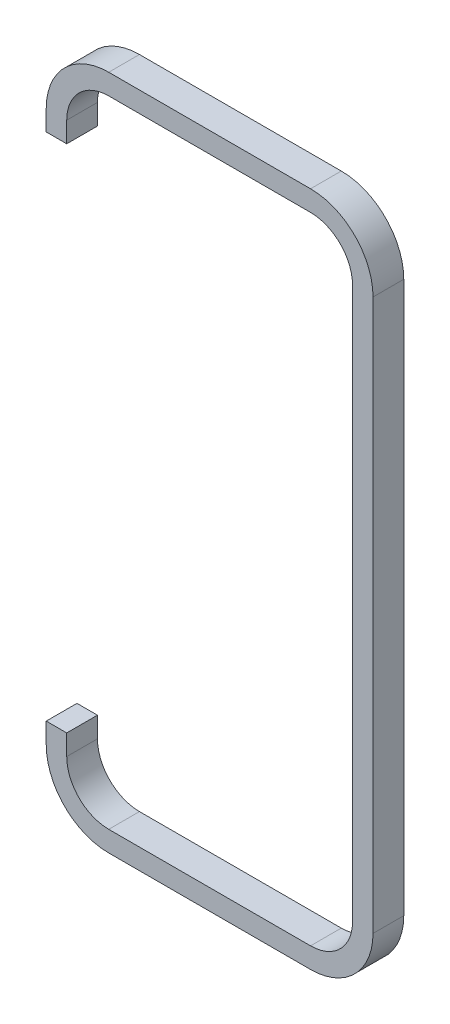
ISO-10303-21;
HEADER;
FILE_DESCRIPTION(('STEP AP214'),'2;1');
FILE_NAME('part.step','',(''),(''),'','','');
FILE_SCHEMA(('AUTOMOTIVE_DESIGN { 1 0 10303 214 1 1 1 1 }'));
ENDSEC;
DATA;
#1=APPLICATION_CONTEXT('core data for automotive mechanical design processes');
#2=APPLICATION_PROTOCOL_DEFINITION('international standard','automotive_design',2000,#1);
#3=PRODUCT_CONTEXT('',#1,'mechanical');
#4=PRODUCT('Part','Part','',(#3));
#5=PRODUCT_RELATED_PRODUCT_CATEGORY('part','',(#4));
#6=PRODUCT_DEFINITION_FORMATION('','',#4);
#7=PRODUCT_DEFINITION_CONTEXT('part definition',#1,'design');
#8=PRODUCT_DEFINITION('design','',#6,#7);
#9=PRODUCT_DEFINITION_SHAPE('','',#8);
#10=(LENGTH_UNIT() NAMED_UNIT(*) SI_UNIT(.MILLI.,.METRE.));
#11=(NAMED_UNIT(*) PLANE_ANGLE_UNIT() SI_UNIT($,.RADIAN.));
#12=(NAMED_UNIT(*) SI_UNIT($,.STERADIAN.) SOLID_ANGLE_UNIT());
#13=UNCERTAINTY_MEASURE_WITH_UNIT(LENGTH_MEASURE(1.E-05),#10,'distance_accuracy_value','');
#14=(GEOMETRIC_REPRESENTATION_CONTEXT(3) GLOBAL_UNCERTAINTY_ASSIGNED_CONTEXT((#13)) GLOBAL_UNIT_ASSIGNED_CONTEXT((#10,
#11,#12)) REPRESENTATION_CONTEXT('',''));
#15=CARTESIAN_POINT('',(0.,0.,0.));
#16=DIRECTION('',(0.,0.,1.));
#17=DIRECTION('',(1.,0.,0.));
#18=AXIS2_PLACEMENT_3D('',#15,#16,#17);
#19=CARTESIAN_POINT('',(-9.85,-26.9,3.));
#20=DIRECTION('',(0.,0.,-1.));
#21=DIRECTION('',(-1.,0.,0.));
#22=AXIS2_PLACEMENT_3D('',#19,#20,#21);
#23=CYLINDRICAL_SURFACE('',#22,4.09999999999999);
#24=CARTESIAN_POINT('',(-9.85,-26.9,0.));
#25=DIRECTION('',(0.,0.,-1.));
#26=DIRECTION('',(-1.,0.,0.));
#27=AXIS2_PLACEMENT_3D('',#24,#25,#26);
#28=CIRCLE('',#27,4.09999999999999);
#29=CARTESIAN_POINT('',(-9.84999999999994,-31.,0.));
#30=VERTEX_POINT('',#29);
#31=CARTESIAN_POINT('',(-13.95,-26.8999999999999,0.));
#32=VERTEX_POINT('',#31);
#33=EDGE_CURVE('E218',#30,#32,#28,.T.);
#34=ORIENTED_EDGE('',*,*,#33,.T.);
#35=DIRECTION('',(0.,0.,-1.));
#36=VECTOR('',#35,1.);
#37=CARTESIAN_POINT('',(-13.95,-26.8999999999999,3.));
#38=LINE('',#37,#36);
#39=CARTESIAN_POINT('',(-13.95,-26.8999999999999,3.));
#40=VERTEX_POINT('',#39);
#41=EDGE_CURVE('E11',#40,#32,#38,.T.);
#42=ORIENTED_EDGE('',*,*,#41,.F.);
#43=CARTESIAN_POINT('',(-9.85,-26.9,3.));
#44=DIRECTION('',(0.,0.,-1.));
#45=DIRECTION('',(-1.,0.,0.));
#46=AXIS2_PLACEMENT_3D('',#43,#44,#45);
#47=CIRCLE('',#46,4.09999999999999);
#48=CARTESIAN_POINT('',(-9.84999999999994,-31.,3.));
#49=VERTEX_POINT('',#48);
#50=EDGE_CURVE('E275',#49,#40,#47,.T.);
#51=ORIENTED_EDGE('',*,*,#50,.F.);
#52=DIRECTION('',(0.,0.,-1.));
#53=VECTOR('',#52,1.);
#54=CARTESIAN_POINT('',(-9.84999999999994,-31.,3.));
#55=LINE('',#54,#53);
#56=EDGE_CURVE('E214',#49,#30,#55,.T.);
#57=ORIENTED_EDGE('',*,*,#56,.T.);
#58=EDGE_LOOP('',(#34,#42,#51,#57));
#59=FACE_BOUND('',#58,.T.);
#60=ADVANCED_FACE('F43',(#59),#23,.F.);
#61=CARTESIAN_POINT('',(-13.95,-26.8999999999999,3.));
#62=DIRECTION('',(-1.,0.,0.));
#63=DIRECTION('',(0.,-1.,0.));
#64=AXIS2_PLACEMENT_3D('',#61,#62,#63);
#65=PLANE('',#64);
#66=DIRECTION('',(0.,1.,0.));
#67=VECTOR('',#66,1.);
#68=CARTESIAN_POINT('',(-13.95,-26.8999999999999,0.));
#69=LINE('',#68,#67);
#70=CARTESIAN_POINT('',(-13.95,-24.9,0.));
#71=VERTEX_POINT('',#70);
#72=EDGE_CURVE('E222',#32,#71,#69,.T.);
#73=ORIENTED_EDGE('',*,*,#72,.T.);
#74=DIRECTION('',(0.,0.,-1.));
#75=VECTOR('',#74,1.);
#76=CARTESIAN_POINT('',(-13.95,-24.9,3.));
#77=LINE('',#76,#75);
#78=CARTESIAN_POINT('',(-13.95,-24.9,3.));
#79=VERTEX_POINT('',#78);
#80=EDGE_CURVE('E52',#79,#71,#77,.T.);
#81=ORIENTED_EDGE('',*,*,#80,.F.);
#82=DIRECTION('',(0.,1.,0.));
#83=VECTOR('',#82,1.);
#84=CARTESIAN_POINT('',(-13.95,-26.8999999999999,3.));
#85=LINE('',#84,#83);
#86=EDGE_CURVE('E139',#40,#79,#85,.T.);
#87=ORIENTED_EDGE('',*,*,#86,.F.);
#88=ORIENTED_EDGE('',*,*,#41,.T.);
#89=EDGE_LOOP('',(#73,#81,#87,#88));
#90=FACE_BOUND('',#89,.T.);
#91=ADVANCED_FACE('F408',(#90),#65,.F.);
#92=CARTESIAN_POINT('',(-15.95,-24.9,3.));
#93=DIRECTION('',(0.,-1.,0.));
#94=DIRECTION('',(0.,0.,-1.));
#95=AXIS2_PLACEMENT_3D('',#92,#93,#94);
#96=PLANE('',#95);
#97=DIRECTION('',(-1.,0.,0.));
#98=VECTOR('',#97,1.);
#99=CARTESIAN_POINT('',(-15.95,-24.9,0.));
#100=LINE('',#99,#98);
#101=CARTESIAN_POINT('',(-15.95,-24.9,0.));
#102=VERTEX_POINT('',#101);
#103=EDGE_CURVE('E225',#71,#102,#100,.T.);
#104=ORIENTED_EDGE('',*,*,#103,.T.);
#105=DIRECTION('',(0.,0.,-1.));
#106=VECTOR('',#105,1.);
#107=CARTESIAN_POINT('',(-15.95,-24.9,3.));
#108=LINE('',#107,#106);
#109=CARTESIAN_POINT('',(-15.95,-24.9,3.));
#110=VERTEX_POINT('',#109);
#111=EDGE_CURVE('E334',#110,#102,#108,.T.);
#112=ORIENTED_EDGE('',*,*,#111,.F.);
#113=DIRECTION('',(-1.,0.,0.));
#114=VECTOR('',#113,1.);
#115=CARTESIAN_POINT('',(-15.95,-24.9,3.));
#116=LINE('',#115,#114);
#117=EDGE_CURVE('E344',#79,#110,#116,.T.);
#118=ORIENTED_EDGE('',*,*,#117,.F.);
#119=ORIENTED_EDGE('',*,*,#80,.T.);
#120=EDGE_LOOP('',(#104,#112,#118,#119));
#121=FACE_BOUND('',#120,.T.);
#122=ADVANCED_FACE('F342',(#121),#96,.F.);
#123=CARTESIAN_POINT('',(-15.95,-26.8999999999999,3.));
#124=DIRECTION('',(1.,0.,0.));
#125=DIRECTION('',(0.,0.,-1.));
#126=AXIS2_PLACEMENT_3D('',#123,#124,#125);
#127=PLANE('',#126);
#128=DIRECTION('',(0.,-1.,0.));
#129=VECTOR('',#128,1.);
#130=CARTESIAN_POINT('',(-15.95,-26.8999999999999,0.));
#131=LINE('',#130,#129);
#132=CARTESIAN_POINT('',(-15.95,-26.8999999999999,0.));
#133=VERTEX_POINT('',#132);
#134=EDGE_CURVE('E227',#102,#133,#131,.T.);
#135=ORIENTED_EDGE('',*,*,#134,.T.);
#136=DIRECTION('',(0.,0.,-1.));
#137=VECTOR('',#136,1.);
#138=CARTESIAN_POINT('',(-15.95,-26.8999999999999,3.));
#139=LINE('',#138,#137);
#140=CARTESIAN_POINT('',(-15.95,-26.8999999999999,3.));
#141=VERTEX_POINT('',#140);
#142=EDGE_CURVE('E330',#141,#133,#139,.T.);
#143=ORIENTED_EDGE('',*,*,#142,.F.);
#144=DIRECTION('',(0.,-1.,0.));
#145=VECTOR('',#144,1.);
#146=CARTESIAN_POINT('',(-15.95,-26.8999999999999,3.));
#147=LINE('',#146,#145);
#148=EDGE_CURVE('E363',#110,#141,#147,.T.);
#149=ORIENTED_EDGE('',*,*,#148,.F.);
#150=ORIENTED_EDGE('',*,*,#111,.T.);
#151=EDGE_LOOP('',(#135,#143,#149,#150));
#152=FACE_BOUND('',#151,.T.);
#153=ADVANCED_FACE('F353',(#152),#127,.F.);
#154=CARTESIAN_POINT('',(-9.85,-26.9,3.));
#155=DIRECTION('',(0.,0.,-1.));
#156=DIRECTION('',(-1.,0.,0.));
#157=AXIS2_PLACEMENT_3D('',#154,#155,#156);
#158=CYLINDRICAL_SURFACE('',#157,6.1);
#159=CARTESIAN_POINT('',(-9.85,-26.9,0.));
#160=DIRECTION('',(0.,0.,1.));
#161=DIRECTION('',(-1.,0.,0.));
#162=AXIS2_PLACEMENT_3D('',#159,#160,#161);
#163=CIRCLE('',#162,6.1);
#164=CARTESIAN_POINT('',(-9.84999999999994,-33.,0.));
#165=VERTEX_POINT('',#164);
#166=EDGE_CURVE('E230',#133,#165,#163,.T.);
#167=ORIENTED_EDGE('',*,*,#166,.T.);
#168=DIRECTION('',(0.,0.,-1.));
#169=VECTOR('',#168,1.);
#170=CARTESIAN_POINT('',(-9.84999999999994,-33.,3.));
#171=LINE('',#170,#169);
#172=CARTESIAN_POINT('',(-9.84999999999994,-33.,3.));
#173=VERTEX_POINT('',#172);
#174=EDGE_CURVE('E326',#173,#165,#171,.T.);
#175=ORIENTED_EDGE('',*,*,#174,.F.);
#176=CARTESIAN_POINT('',(-9.85,-26.9,3.));
#177=DIRECTION('',(0.,0.,1.));
#178=DIRECTION('',(-1.,0.,0.));
#179=AXIS2_PLACEMENT_3D('',#176,#177,#178);
#180=CIRCLE('',#179,6.1);
#181=EDGE_CURVE('E359',#141,#173,#180,.T.);
#182=ORIENTED_EDGE('',*,*,#181,.F.);
#183=ORIENTED_EDGE('',*,*,#142,.T.);
#184=EDGE_LOOP('',(#167,#175,#182,#183));
#185=FACE_BOUND('',#184,.T.);
#186=ADVANCED_FACE('F357',(#185),#158,.T.);
#187=CARTESIAN_POINT('',(9.84999999999991,-33.,3.));
#188=DIRECTION('',(0.,1.,0.));
#189=DIRECTION('',(0.,0.,1.));
#190=AXIS2_PLACEMENT_3D('',#187,#188,#189);
#191=PLANE('',#190);
#192=DIRECTION('',(1.,0.,0.));
#193=VECTOR('',#192,1.);
#194=CARTESIAN_POINT('',(9.84999999999991,-33.,0.));
#195=LINE('',#194,#193);
#196=CARTESIAN_POINT('',(9.84999999999991,-33.,0.));
#197=VERTEX_POINT('',#196);
#198=EDGE_CURVE('E233',#165,#197,#195,.T.);
#199=ORIENTED_EDGE('',*,*,#198,.T.);
#200=DIRECTION('',(0.,0.,-1.));
#201=VECTOR('',#200,1.);
#202=CARTESIAN_POINT('',(9.84999999999991,-33.,3.));
#203=LINE('',#202,#201);
#204=CARTESIAN_POINT('',(9.84999999999991,-33.,3.));
#205=VERTEX_POINT('',#204);
#206=EDGE_CURVE('E322',#205,#197,#203,.T.);
#207=ORIENTED_EDGE('',*,*,#206,.F.);
#208=DIRECTION('',(1.,0.,0.));
#209=VECTOR('',#208,1.);
#210=CARTESIAN_POINT('',(9.84999999999991,-33.,3.));
#211=LINE('',#210,#209);
#212=EDGE_CURVE('E362',#173,#205,#211,.T.);
#213=ORIENTED_EDGE('',*,*,#212,.F.);
#214=ORIENTED_EDGE('',*,*,#174,.T.);
#215=EDGE_LOOP('',(#199,#207,#213,#214));
#216=FACE_BOUND('',#215,.T.);
#217=ADVANCED_FACE('F419',(#216),#191,.F.);
#218=CARTESIAN_POINT('',(9.85,-26.9,3.));
#219=DIRECTION('',(0.,0.,-1.));
#220=DIRECTION('',(-1.,0.,0.));
#221=AXIS2_PLACEMENT_3D('',#218,#219,#220);
#222=CYLINDRICAL_SURFACE('',#221,6.1);
#223=CARTESIAN_POINT('',(9.85,-26.9,0.));
#224=DIRECTION('',(0.,0.,1.));
#225=DIRECTION('',(-1.,0.,0.));
#226=AXIS2_PLACEMENT_3D('',#223,#224,#225);
#227=CIRCLE('',#226,6.1);
#228=CARTESIAN_POINT('',(15.95,-26.8999999999999,0.));
#229=VERTEX_POINT('',#228);
#230=EDGE_CURVE('E236',#197,#229,#227,.T.);
#231=ORIENTED_EDGE('',*,*,#230,.T.);
#232=DIRECTION('',(0.,0.,-1.));
#233=VECTOR('',#232,1.);
#234=CARTESIAN_POINT('',(15.95,-26.8999999999999,3.));
#235=LINE('',#234,#233);
#236=CARTESIAN_POINT('',(15.95,-26.8999999999999,3.));
#237=VERTEX_POINT('',#236);
#238=EDGE_CURVE('E318',#237,#229,#235,.T.);
#239=ORIENTED_EDGE('',*,*,#238,.F.);
#240=CARTESIAN_POINT('',(9.85,-26.9,3.));
#241=DIRECTION('',(0.,0.,1.));
#242=DIRECTION('',(-1.,0.,0.));
#243=AXIS2_PLACEMENT_3D('',#240,#241,#242);
#244=CIRCLE('',#243,6.1);
#245=EDGE_CURVE('E367',#205,#237,#244,.T.);
#246=ORIENTED_EDGE('',*,*,#245,.F.);
#247=ORIENTED_EDGE('',*,*,#206,.T.);
#248=EDGE_LOOP('',(#231,#239,#246,#247));
#249=FACE_BOUND('',#248,.T.);
#250=ADVANCED_FACE('F422',(#249),#222,.T.);
#251=CARTESIAN_POINT('',(15.95,-26.8999999999999,3.));
#252=DIRECTION('',(-1.,0.,0.));
#253=DIRECTION('',(0.,0.,1.));
#254=AXIS2_PLACEMENT_3D('',#251,#252,#253);
#255=PLANE('',#254);
#256=DIRECTION('',(0.,1.,0.));
#257=VECTOR('',#256,1.);
#258=CARTESIAN_POINT('',(15.95,-26.8999999999999,0.));
#259=LINE('',#258,#257);
#260=CARTESIAN_POINT('',(15.95,26.8999999999999,0.));
#261=VERTEX_POINT('',#260);
#262=EDGE_CURVE('E239',#229,#261,#259,.T.);
#263=ORIENTED_EDGE('',*,*,#262,.T.);
#264=DIRECTION('',(0.,0.,-1.));
#265=VECTOR('',#264,1.);
#266=CARTESIAN_POINT('',(15.95,26.8999999999999,3.));
#267=LINE('',#266,#265);
#268=CARTESIAN_POINT('',(15.95,26.8999999999999,3.));
#269=VERTEX_POINT('',#268);
#270=EDGE_CURVE('E314',#269,#261,#267,.T.);
#271=ORIENTED_EDGE('',*,*,#270,.F.);
#272=DIRECTION('',(0.,1.,0.));
#273=VECTOR('',#272,1.);
#274=CARTESIAN_POINT('',(15.95,-26.8999999999999,3.));
#275=LINE('',#274,#273);
#276=EDGE_CURVE('E375',#237,#269,#275,.T.);
#277=ORIENTED_EDGE('',*,*,#276,.F.);
#278=ORIENTED_EDGE('',*,*,#238,.T.);
#279=EDGE_LOOP('',(#263,#271,#277,#278));
#280=FACE_BOUND('',#279,.T.);
#281=ADVANCED_FACE('F426',(#280),#255,.F.);
#282=CARTESIAN_POINT('',(9.85,26.9,3.));
#283=DIRECTION('',(0.,0.,-1.));
#284=DIRECTION('',(-1.,0.,0.));
#285=AXIS2_PLACEMENT_3D('',#282,#283,#284);
#286=CYLINDRICAL_SURFACE('',#285,6.1);
#287=CARTESIAN_POINT('',(9.85,26.9,0.));
#288=DIRECTION('',(0.,0.,1.));
#289=DIRECTION('',(1.,0.,0.));
#290=AXIS2_PLACEMENT_3D('',#287,#288,#289);
#291=CIRCLE('',#290,6.1);
#292=CARTESIAN_POINT('',(9.84999999999994,33.,0.));
#293=VERTEX_POINT('',#292);
#294=EDGE_CURVE('E242',#261,#293,#291,.T.);
#295=ORIENTED_EDGE('',*,*,#294,.T.);
#296=DIRECTION('',(0.,0.,-1.));
#297=VECTOR('',#296,1.);
#298=CARTESIAN_POINT('',(9.84999999999994,33.,3.));
#299=LINE('',#298,#297);
#300=CARTESIAN_POINT('',(9.84999999999994,33.,3.));
#301=VERTEX_POINT('',#300);
#302=EDGE_CURVE('E310',#301,#293,#299,.T.);
#303=ORIENTED_EDGE('',*,*,#302,.F.);
#304=CARTESIAN_POINT('',(9.85,26.9,3.));
#305=DIRECTION('',(0.,0.,1.));
#306=DIRECTION('',(1.,0.,0.));
#307=AXIS2_PLACEMENT_3D('',#304,#305,#306);
#308=CIRCLE('',#307,6.1);
#309=EDGE_CURVE('E378',#269,#301,#308,.T.);
#310=ORIENTED_EDGE('',*,*,#309,.F.);
#311=ORIENTED_EDGE('',*,*,#270,.T.);
#312=EDGE_LOOP('',(#295,#303,#310,#311));
#313=FACE_BOUND('',#312,.T.);
#314=ADVANCED_FACE('F430',(#313),#286,.T.);
#315=CARTESIAN_POINT('',(9.84999999999994,33.,3.));
#316=DIRECTION('',(0.,-1.,0.));
#317=DIRECTION('',(0.,0.,-1.));
#318=AXIS2_PLACEMENT_3D('',#315,#316,#317);
#319=PLANE('',#318);
#320=DIRECTION('',(-1.,0.,0.));
#321=VECTOR('',#320,1.);
#322=CARTESIAN_POINT('',(9.84999999999994,33.,0.));
#323=LINE('',#322,#321);
#324=CARTESIAN_POINT('',(-9.84999999999992,33.,0.));
#325=VERTEX_POINT('',#324);
#326=EDGE_CURVE('E245',#293,#325,#323,.T.);
#327=ORIENTED_EDGE('',*,*,#326,.T.);
#328=DIRECTION('',(0.,0.,-1.));
#329=VECTOR('',#328,1.);
#330=CARTESIAN_POINT('',(-9.84999999999992,33.,3.));
#331=LINE('',#330,#329);
#332=CARTESIAN_POINT('',(-9.84999999999992,33.,3.));
#333=VERTEX_POINT('',#332);
#334=EDGE_CURVE('E306',#333,#325,#331,.T.);
#335=ORIENTED_EDGE('',*,*,#334,.F.);
#336=DIRECTION('',(-1.,0.,0.));
#337=VECTOR('',#336,1.);
#338=CARTESIAN_POINT('',(9.84999999999994,33.,3.));
#339=LINE('',#338,#337);
#340=EDGE_CURVE('E381',#301,#333,#339,.T.);
#341=ORIENTED_EDGE('',*,*,#340,.F.);
#342=ORIENTED_EDGE('',*,*,#302,.T.);
#343=EDGE_LOOP('',(#327,#335,#341,#342));
#344=FACE_BOUND('',#343,.T.);
#345=ADVANCED_FACE('F434',(#344),#319,.F.);
#346=CARTESIAN_POINT('',(-9.85,26.9,3.));
#347=DIRECTION('',(0.,0.,-1.));
#348=DIRECTION('',(-1.,0.,0.));
#349=AXIS2_PLACEMENT_3D('',#346,#347,#348);
#350=CYLINDRICAL_SURFACE('',#349,6.1);
#351=CARTESIAN_POINT('',(-9.85,26.9,0.));
#352=DIRECTION('',(0.,0.,1.));
#353=DIRECTION('',(-1.,0.,0.));
#354=AXIS2_PLACEMENT_3D('',#351,#352,#353);
#355=CIRCLE('',#354,6.1);
#356=CARTESIAN_POINT('',(-15.95,26.9,0.));
#357=VERTEX_POINT('',#356);
#358=EDGE_CURVE('E248',#325,#357,#355,.T.);
#359=ORIENTED_EDGE('',*,*,#358,.T.);
#360=DIRECTION('',(0.,0.,-1.));
#361=VECTOR('',#360,1.);
#362=CARTESIAN_POINT('',(-15.95,26.9,3.));
#363=LINE('',#362,#361);
#364=CARTESIAN_POINT('',(-15.95,26.9,3.));
#365=VERTEX_POINT('',#364);
#366=EDGE_CURVE('E302',#365,#357,#363,.T.);
#367=ORIENTED_EDGE('',*,*,#366,.F.);
#368=CARTESIAN_POINT('',(-9.85,26.9,3.));
#369=DIRECTION('',(0.,0.,1.));
#370=DIRECTION('',(-1.,0.,0.));
#371=AXIS2_PLACEMENT_3D('',#368,#369,#370);
#372=CIRCLE('',#371,6.1);
#373=EDGE_CURVE('E383',#333,#365,#372,.T.);
#374=ORIENTED_EDGE('',*,*,#373,.F.);
#375=ORIENTED_EDGE('',*,*,#334,.T.);
#376=EDGE_LOOP('',(#359,#367,#374,#375));
#377=FACE_BOUND('',#376,.T.);
#378=ADVANCED_FACE('F438',(#377),#350,.T.);
#379=CARTESIAN_POINT('',(-15.95,24.9,3.));
#380=DIRECTION('',(1.,0.,0.));
#381=DIRECTION('',(0.,0.,-1.));
#382=AXIS2_PLACEMENT_3D('',#379,#380,#381);
#383=PLANE('',#382);
#384=DIRECTION('',(0.,-1.,0.));
#385=VECTOR('',#384,1.);
#386=CARTESIAN_POINT('',(-15.95,24.9,0.));
#387=LINE('',#386,#385);
#388=CARTESIAN_POINT('',(-15.95,24.9,0.));
#389=VERTEX_POINT('',#388);
#390=EDGE_CURVE('E251',#357,#389,#387,.T.);
#391=ORIENTED_EDGE('',*,*,#390,.T.);
#392=DIRECTION('',(0.,0.,-1.));
#393=VECTOR('',#392,1.);
#394=CARTESIAN_POINT('',(-15.95,24.9,3.));
#395=LINE('',#394,#393);
#396=CARTESIAN_POINT('',(-15.95,24.9,3.));
#397=VERTEX_POINT('',#396);
#398=EDGE_CURVE('E298',#397,#389,#395,.T.);
#399=ORIENTED_EDGE('',*,*,#398,.F.);
#400=DIRECTION('',(0.,-1.,0.));
#401=VECTOR('',#400,1.);
#402=CARTESIAN_POINT('',(-15.95,24.9,3.));
#403=LINE('',#402,#401);
#404=EDGE_CURVE('E386',#365,#397,#403,.T.);
#405=ORIENTED_EDGE('',*,*,#404,.F.);
#406=ORIENTED_EDGE('',*,*,#366,.T.);
#407=EDGE_LOOP('',(#391,#399,#405,#406));
#408=FACE_BOUND('',#407,.T.);
#409=ADVANCED_FACE('F442',(#408),#383,.F.);
#410=CARTESIAN_POINT('',(-15.95,24.9,3.));
#411=DIRECTION('',(0.,1.,0.));
#412=DIRECTION('',(0.,0.,1.));
#413=AXIS2_PLACEMENT_3D('',#410,#411,#412);
#414=PLANE('',#413);
#415=DIRECTION('',(1.,0.,0.));
#416=VECTOR('',#415,1.);
#417=CARTESIAN_POINT('',(-15.95,24.9,0.));
#418=LINE('',#417,#416);
#419=CARTESIAN_POINT('',(-13.95,24.9,0.));
#420=VERTEX_POINT('',#419);
#421=EDGE_CURVE('E254',#389,#420,#418,.T.);
#422=ORIENTED_EDGE('',*,*,#421,.T.);
#423=DIRECTION('',(0.,0.,-1.));
#424=VECTOR('',#423,1.);
#425=CARTESIAN_POINT('',(-13.95,24.9,3.));
#426=LINE('',#425,#424);
#427=CARTESIAN_POINT('',(-13.95,24.9,3.));
#428=VERTEX_POINT('',#427);
#429=EDGE_CURVE('E294',#428,#420,#426,.T.);
#430=ORIENTED_EDGE('',*,*,#429,.F.);
#431=DIRECTION('',(1.,0.,0.));
#432=VECTOR('',#431,1.);
#433=CARTESIAN_POINT('',(-15.95,24.9,3.));
#434=LINE('',#433,#432);
#435=EDGE_CURVE('E389',#397,#428,#434,.T.);
#436=ORIENTED_EDGE('',*,*,#435,.F.);
#437=ORIENTED_EDGE('',*,*,#398,.T.);
#438=EDGE_LOOP('',(#422,#430,#436,#437));
#439=FACE_BOUND('',#438,.T.);
#440=ADVANCED_FACE('F446',(#439),#414,.F.);
#441=CARTESIAN_POINT('',(-13.95,24.9,3.));
#442=DIRECTION('',(-1.,0.,0.));
#443=DIRECTION('',(0.,-1.,0.));
#444=AXIS2_PLACEMENT_3D('',#441,#442,#443);
#445=PLANE('',#444);
#446=DIRECTION('',(0.,1.,0.));
#447=VECTOR('',#446,1.);
#448=CARTESIAN_POINT('',(-13.95,24.9,0.));
#449=LINE('',#448,#447);
#450=CARTESIAN_POINT('',(-13.95,26.9,0.));
#451=VERTEX_POINT('',#450);
#452=EDGE_CURVE('E257',#420,#451,#449,.T.);
#453=ORIENTED_EDGE('',*,*,#452,.T.);
#454=DIRECTION('',(0.,0.,-1.));
#455=VECTOR('',#454,1.);
#456=CARTESIAN_POINT('',(-13.95,26.9,3.));
#457=LINE('',#456,#455);
#458=CARTESIAN_POINT('',(-13.95,26.9,3.));
#459=VERTEX_POINT('',#458);
#460=EDGE_CURVE('E290',#459,#451,#457,.T.);
#461=ORIENTED_EDGE('',*,*,#460,.F.);
#462=DIRECTION('',(0.,1.,0.));
#463=VECTOR('',#462,1.);
#464=CARTESIAN_POINT('',(-13.95,24.9,3.));
#465=LINE('',#464,#463);
#466=EDGE_CURVE('E392',#428,#459,#465,.T.);
#467=ORIENTED_EDGE('',*,*,#466,.F.);
#468=ORIENTED_EDGE('',*,*,#429,.T.);
#469=EDGE_LOOP('',(#453,#461,#467,#468));
#470=FACE_BOUND('',#469,.T.);
#471=ADVANCED_FACE('F450',(#470),#445,.F.);
#472=CARTESIAN_POINT('',(-9.85,26.9,3.));
#473=DIRECTION('',(0.,0.,-1.));
#474=DIRECTION('',(-1.,0.,0.));
#475=AXIS2_PLACEMENT_3D('',#472,#473,#474);
#476=CYLINDRICAL_SURFACE('',#475,4.09999999999999);
#477=CARTESIAN_POINT('',(-9.85,26.9,0.));
#478=DIRECTION('',(0.,0.,-1.));
#479=DIRECTION('',(-1.,0.,0.));
#480=AXIS2_PLACEMENT_3D('',#477,#478,#479);
#481=CIRCLE('',#480,4.09999999999999);
#482=CARTESIAN_POINT('',(-9.84999999999995,31.,0.));
#483=VERTEX_POINT('',#482);
#484=EDGE_CURVE('E260',#451,#483,#481,.T.);
#485=ORIENTED_EDGE('',*,*,#484,.T.);
#486=DIRECTION('',(0.,0.,-1.));
#487=VECTOR('',#486,1.);
#488=CARTESIAN_POINT('',(-9.84999999999995,31.,3.));
#489=LINE('',#488,#487);
#490=CARTESIAN_POINT('',(-9.84999999999995,31.,3.));
#491=VERTEX_POINT('',#490);
#492=EDGE_CURVE('E286',#491,#483,#489,.T.);
#493=ORIENTED_EDGE('',*,*,#492,.F.);
#494=CARTESIAN_POINT('',(-9.85,26.9,3.));
#495=DIRECTION('',(0.,0.,-1.));
#496=DIRECTION('',(-1.,0.,0.));
#497=AXIS2_PLACEMENT_3D('',#494,#495,#496);
#498=CIRCLE('',#497,4.09999999999999);
#499=EDGE_CURVE('E395',#459,#491,#498,.T.);
#500=ORIENTED_EDGE('',*,*,#499,.F.);
#501=ORIENTED_EDGE('',*,*,#460,.T.);
#502=EDGE_LOOP('',(#485,#493,#500,#501));
#503=FACE_BOUND('',#502,.T.);
#504=ADVANCED_FACE('F454',(#503),#476,.F.);
#505=CARTESIAN_POINT('',(9.84999999999994,31.,3.));
#506=DIRECTION('',(0.,1.,0.));
#507=DIRECTION('',(-1.,0.,0.));
#508=AXIS2_PLACEMENT_3D('',#505,#506,#507);
#509=PLANE('',#508);
#510=DIRECTION('',(1.,0.,0.));
#511=VECTOR('',#510,1.);
#512=CARTESIAN_POINT('',(9.84999999999994,31.,0.));
#513=LINE('',#512,#511);
#514=CARTESIAN_POINT('',(9.84999999999994,31.,0.));
#515=VERTEX_POINT('',#514);
#516=EDGE_CURVE('E263',#483,#515,#513,.T.);
#517=ORIENTED_EDGE('',*,*,#516,.T.);
#518=DIRECTION('',(0.,0.,-1.));
#519=VECTOR('',#518,1.);
#520=CARTESIAN_POINT('',(9.84999999999994,31.,3.));
#521=LINE('',#520,#519);
#522=CARTESIAN_POINT('',(9.84999999999994,31.,3.));
#523=VERTEX_POINT('',#522);
#524=EDGE_CURVE('E282',#523,#515,#521,.T.);
#525=ORIENTED_EDGE('',*,*,#524,.F.);
#526=DIRECTION('',(1.,0.,0.));
#527=VECTOR('',#526,1.);
#528=CARTESIAN_POINT('',(9.84999999999994,31.,3.));
#529=LINE('',#528,#527);
#530=EDGE_CURVE('E398',#491,#523,#529,.T.);
#531=ORIENTED_EDGE('',*,*,#530,.F.);
#532=ORIENTED_EDGE('',*,*,#492,.T.);
#533=EDGE_LOOP('',(#517,#525,#531,#532));
#534=FACE_BOUND('',#533,.T.);
#535=ADVANCED_FACE('F458',(#534),#509,.F.);
#536=CARTESIAN_POINT('',(9.85,26.9,3.));
#537=DIRECTION('',(0.,0.,-1.));
#538=DIRECTION('',(-1.,0.,0.));
#539=AXIS2_PLACEMENT_3D('',#536,#537,#538);
#540=CYLINDRICAL_SURFACE('',#539,4.10000000000001);
#541=CARTESIAN_POINT('',(9.85,26.9,0.));
#542=DIRECTION('',(0.,0.,-1.));
#543=DIRECTION('',(1.,0.,0.));
#544=AXIS2_PLACEMENT_3D('',#541,#542,#543);
#545=CIRCLE('',#544,4.10000000000001);
#546=CARTESIAN_POINT('',(13.95,26.8999999999999,0.));
#547=VERTEX_POINT('',#546);
#548=EDGE_CURVE('E266',#515,#547,#545,.T.);
#549=ORIENTED_EDGE('',*,*,#548,.T.);
#550=DIRECTION('',(0.,0.,-1.));
#551=VECTOR('',#550,1.);
#552=CARTESIAN_POINT('',(13.95,26.8999999999999,3.));
#553=LINE('',#552,#551);
#554=CARTESIAN_POINT('',(13.95,26.8999999999999,3.));
#555=VERTEX_POINT('',#554);
#556=EDGE_CURVE('E205',#555,#547,#553,.T.);
#557=ORIENTED_EDGE('',*,*,#556,.F.);
#558=CARTESIAN_POINT('',(9.85,26.9,3.));
#559=DIRECTION('',(0.,0.,-1.));
#560=DIRECTION('',(1.,0.,0.));
#561=AXIS2_PLACEMENT_3D('',#558,#559,#560);
#562=CIRCLE('',#561,4.10000000000001);
#563=EDGE_CURVE('E194',#523,#555,#562,.T.);
#564=ORIENTED_EDGE('',*,*,#563,.F.);
#565=ORIENTED_EDGE('',*,*,#524,.T.);
#566=EDGE_LOOP('',(#549,#557,#564,#565));
#567=FACE_BOUND('',#566,.T.);
#568=ADVANCED_FACE('F462',(#567),#540,.F.);
#569=CARTESIAN_POINT('',(13.95,-26.8999999999999,3.));
#570=DIRECTION('',(1.,0.,0.));
#571=DIRECTION('',(0.,1.,0.));
#572=AXIS2_PLACEMENT_3D('',#569,#570,#571);
#573=PLANE('',#572);
#574=DIRECTION('',(0.,-1.,0.));
#575=VECTOR('',#574,1.);
#576=CARTESIAN_POINT('',(13.95,-26.8999999999999,0.));
#577=LINE('',#576,#575);
#578=CARTESIAN_POINT('',(13.95,-26.8999999999999,0.));
#579=VERTEX_POINT('',#578);
#580=EDGE_CURVE('E203',#547,#579,#577,.T.);
#581=ORIENTED_EDGE('',*,*,#580,.T.);
#582=DIRECTION('',(0.,0.,-1.));
#583=VECTOR('',#582,1.);
#584=CARTESIAN_POINT('',(13.95,-26.8999999999999,3.));
#585=LINE('',#584,#583);
#586=CARTESIAN_POINT('',(13.95,-26.8999999999999,3.));
#587=VERTEX_POINT('',#586);
#588=EDGE_CURVE('E200',#587,#579,#585,.T.);
#589=ORIENTED_EDGE('',*,*,#588,.F.);
#590=DIRECTION('',(0.,-1.,0.));
#591=VECTOR('',#590,1.);
#592=CARTESIAN_POINT('',(13.95,-26.8999999999999,3.));
#593=LINE('',#592,#591);
#594=EDGE_CURVE('E188',#555,#587,#593,.T.);
#595=ORIENTED_EDGE('',*,*,#594,.F.);
#596=ORIENTED_EDGE('',*,*,#556,.T.);
#597=EDGE_LOOP('',(#581,#589,#595,#596));
#598=FACE_BOUND('',#597,.T.);
#599=ADVANCED_FACE('F201',(#598),#573,.F.);
#600=CARTESIAN_POINT('',(9.85,-26.9,3.));
#601=DIRECTION('',(0.,0.,-1.));
#602=DIRECTION('',(-1.,0.,0.));
#603=AXIS2_PLACEMENT_3D('',#600,#601,#602);
#604=CYLINDRICAL_SURFACE('',#603,4.10000000000001);
#605=CARTESIAN_POINT('',(9.85,-26.9,0.));
#606=DIRECTION('',(0.,0.,-1.));
#607=DIRECTION('',(-1.,0.,0.));
#608=AXIS2_PLACEMENT_3D('',#605,#606,#607);
#609=CIRCLE('',#608,4.10000000000001);
#610=CARTESIAN_POINT('',(9.84999999999994,-31.,0.));
#611=VERTEX_POINT('',#610);
#612=EDGE_CURVE('E125',#579,#611,#609,.T.);
#613=ORIENTED_EDGE('',*,*,#612,.T.);
#614=DIRECTION('',(0.,0.,-1.));
#615=VECTOR('',#614,1.);
#616=CARTESIAN_POINT('',(9.84999999999994,-31.,3.));
#617=LINE('',#616,#615);
#618=CARTESIAN_POINT('',(9.84999999999994,-31.,3.));
#619=VERTEX_POINT('',#618);
#620=EDGE_CURVE('E206',#619,#611,#617,.T.);
#621=ORIENTED_EDGE('',*,*,#620,.F.);
#622=CARTESIAN_POINT('',(9.85,-26.9,3.));
#623=DIRECTION('',(0.,0.,-1.));
#624=DIRECTION('',(-1.,0.,0.));
#625=AXIS2_PLACEMENT_3D('',#622,#623,#624);
#626=CIRCLE('',#625,4.10000000000001);
#627=EDGE_CURVE('E192',#587,#619,#626,.T.);
#628=ORIENTED_EDGE('',*,*,#627,.F.);
#629=ORIENTED_EDGE('',*,*,#588,.T.);
#630=EDGE_LOOP('',(#613,#621,#628,#629));
#631=FACE_BOUND('',#630,.T.);
#632=ADVANCED_FACE('F208',(#631),#604,.F.);
#633=CARTESIAN_POINT('',(9.84999999999994,-31.,3.));
#634=DIRECTION('',(0.,-1.,0.));
#635=DIRECTION('',(1.,0.,0.));
#636=AXIS2_PLACEMENT_3D('',#633,#634,#635);
#637=PLANE('',#636);
#638=DIRECTION('',(-1.,0.,0.));
#639=VECTOR('',#638,1.);
#640=CARTESIAN_POINT('',(9.84999999999994,-31.,0.));
#641=LINE('',#640,#639);
#642=EDGE_CURVE('E131',#611,#30,#641,.T.);
#643=ORIENTED_EDGE('',*,*,#642,.T.);
#644=ORIENTED_EDGE('',*,*,#56,.F.);
#645=DIRECTION('',(-1.,0.,0.));
#646=VECTOR('',#645,1.);
#647=CARTESIAN_POINT('',(9.84999999999994,-31.,3.));
#648=LINE('',#647,#646);
#649=EDGE_CURVE('E60',#619,#49,#648,.T.);
#650=ORIENTED_EDGE('',*,*,#649,.F.);
#651=ORIENTED_EDGE('',*,*,#620,.T.);
#652=EDGE_LOOP('',(#643,#644,#650,#651));
#653=FACE_BOUND('',#652,.T.);
#654=ADVANCED_FACE('F471',(#653),#637,.F.);
#655=CARTESIAN_POINT('',(-9.85,-26.9,3.));
#656=DIRECTION('',(0.,0.,-1.));
#657=DIRECTION('',(-1.,0.,0.));
#658=AXIS2_PLACEMENT_3D('',#655,#656,#657);
#659=PLANE('',#658);
#660=ORIENTED_EDGE('',*,*,#50,.T.);
#661=ORIENTED_EDGE('',*,*,#86,.T.);
#662=ORIENTED_EDGE('',*,*,#117,.T.);
#663=ORIENTED_EDGE('',*,*,#148,.T.);
#664=ORIENTED_EDGE('',*,*,#181,.T.);
#665=ORIENTED_EDGE('',*,*,#212,.T.);
#666=ORIENTED_EDGE('',*,*,#245,.T.);
#667=ORIENTED_EDGE('',*,*,#276,.T.);
#668=ORIENTED_EDGE('',*,*,#309,.T.);
#669=ORIENTED_EDGE('',*,*,#340,.T.);
#670=ORIENTED_EDGE('',*,*,#373,.T.);
#671=ORIENTED_EDGE('',*,*,#404,.T.);
#672=ORIENTED_EDGE('',*,*,#435,.T.);
#673=ORIENTED_EDGE('',*,*,#466,.T.);
#674=ORIENTED_EDGE('',*,*,#499,.T.);
#675=ORIENTED_EDGE('',*,*,#530,.T.);
#676=ORIENTED_EDGE('',*,*,#563,.T.);
#677=ORIENTED_EDGE('',*,*,#594,.T.);
#678=ORIENTED_EDGE('',*,*,#627,.T.);
#679=ORIENTED_EDGE('',*,*,#649,.T.);
#680=EDGE_LOOP('',(#660,#661,#662,#663,#664,#665,#666,#667,#668,#669,#670,#671,#672,#673,#674,
#675,#676,#677,#678,#679));
#681=FACE_BOUND('',#680,.T.);
#682=ADVANCED_FACE('F190',(#681),#659,.F.);
#683=CARTESIAN_POINT('',(-9.85,-26.9,0.));
#684=DIRECTION('',(0.,0.,-1.));
#685=DIRECTION('',(-1.,0.,0.));
#686=AXIS2_PLACEMENT_3D('',#683,#684,#685);
#687=PLANE('',#686);
#688=ORIENTED_EDGE('',*,*,#33,.F.);
#689=ORIENTED_EDGE('',*,*,#642,.F.);
#690=ORIENTED_EDGE('',*,*,#612,.F.);
#691=ORIENTED_EDGE('',*,*,#580,.F.);
#692=ORIENTED_EDGE('',*,*,#548,.F.);
#693=ORIENTED_EDGE('',*,*,#516,.F.);
#694=ORIENTED_EDGE('',*,*,#484,.F.);
#695=ORIENTED_EDGE('',*,*,#452,.F.);
#696=ORIENTED_EDGE('',*,*,#421,.F.);
#697=ORIENTED_EDGE('',*,*,#390,.F.);
#698=ORIENTED_EDGE('',*,*,#358,.F.);
#699=ORIENTED_EDGE('',*,*,#326,.F.);
#700=ORIENTED_EDGE('',*,*,#294,.F.);
#701=ORIENTED_EDGE('',*,*,#262,.F.);
#702=ORIENTED_EDGE('',*,*,#230,.F.);
#703=ORIENTED_EDGE('',*,*,#198,.F.);
#704=ORIENTED_EDGE('',*,*,#166,.F.);
#705=ORIENTED_EDGE('',*,*,#134,.F.);
#706=ORIENTED_EDGE('',*,*,#103,.F.);
#707=ORIENTED_EDGE('',*,*,#72,.F.);
#708=EDGE_LOOP('',(#688,#689,#690,#691,#692,#693,#694,#695,#696,#697,#698,#699,#700,#701,#702,
#703,#704,#705,#706,#707));
#709=FACE_BOUND('',#708,.T.);
#710=ADVANCED_FACE('F348',(#709),#687,.T.);
#711=CLOSED_SHELL('',(#60,#91,#122,#153,#186,#217,#250,#281,#314,#345,#378,#409,#440,#471,#504,
#535,#568,#599,#632,#654,#682,#710));
#712=MANIFOLD_SOLID_BREP('B2',#711);
#713=ADVANCED_BREP_SHAPE_REPRESENTATION('',(#18,#712),#14);
#714=SHAPE_DEFINITION_REPRESENTATION(#9,#713);
ENDSEC;
END-ISO-10303-21;
